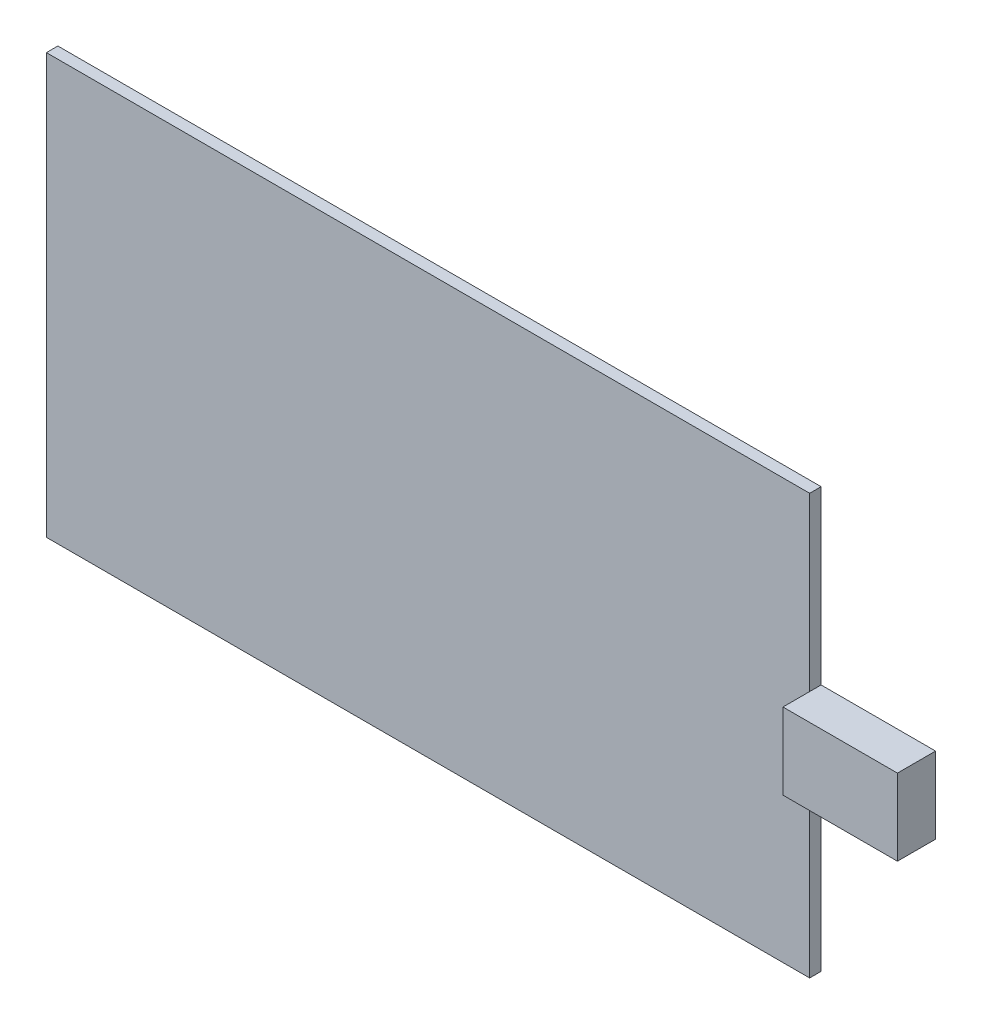
ISO-10303-21;
HEADER;
FILE_DESCRIPTION(('STEP AP214'),'2;1');
FILE_NAME('part.step','',(''),(''),'','','');
FILE_SCHEMA(('AUTOMOTIVE_DESIGN { 1 0 10303 214 1 1 1 1 }'));
ENDSEC;
DATA;
#1=APPLICATION_CONTEXT('core data for automotive mechanical design processes');
#2=APPLICATION_PROTOCOL_DEFINITION('international standard','automotive_design',2000,#1);
#3=PRODUCT_CONTEXT('',#1,'mechanical');
#4=PRODUCT('Part','Part','',(#3));
#5=PRODUCT_RELATED_PRODUCT_CATEGORY('part','',(#4));
#6=PRODUCT_DEFINITION_FORMATION('','',#4);
#7=PRODUCT_DEFINITION_CONTEXT('part definition',#1,'design');
#8=PRODUCT_DEFINITION('design','',#6,#7);
#9=PRODUCT_DEFINITION_SHAPE('','',#8);
#10=(LENGTH_UNIT() NAMED_UNIT(*) SI_UNIT(.MILLI.,.METRE.));
#11=(NAMED_UNIT(*) PLANE_ANGLE_UNIT() SI_UNIT($,.RADIAN.));
#12=(NAMED_UNIT(*) SI_UNIT($,.STERADIAN.) SOLID_ANGLE_UNIT());
#13=UNCERTAINTY_MEASURE_WITH_UNIT(LENGTH_MEASURE(1.E-05),#10,'distance_accuracy_value','');
#14=(GEOMETRIC_REPRESENTATION_CONTEXT(3) GLOBAL_UNCERTAINTY_ASSIGNED_CONTEXT((#13)) GLOBAL_UNIT_ASSIGNED_CONTEXT((#10,
#11,#12)) REPRESENTATION_CONTEXT('',''));
#15=CARTESIAN_POINT('',(0.,0.,0.));
#16=DIRECTION('',(0.,0.,1.));
#17=DIRECTION('',(1.,0.,0.));
#18=AXIS2_PLACEMENT_3D('',#15,#16,#17);
#19=CARTESIAN_POINT('',(0.,0.,1.5));
#20=DIRECTION('',(1.,0.,0.));
#21=DIRECTION('',(0.,0.,-1.));
#22=AXIS2_PLACEMENT_3D('',#19,#20,#21);
#23=PLANE('',#22);
#24=DIRECTION('',(0.,-1.,0.));
#25=VECTOR('',#24,1.);
#26=CARTESIAN_POINT('',(0.,0.,1.5));
#27=LINE('',#26,#25);
#28=CARTESIAN_POINT('',(0.,0.,1.5));
#29=VERTEX_POINT('',#28);
#30=CARTESIAN_POINT('',(0.,-22.5,1.5));
#31=VERTEX_POINT('',#30);
#32=EDGE_CURVE('E190',#29,#31,#27,.T.);
#33=ORIENTED_EDGE('',*,*,#32,.T.);
#34=DIRECTION('',(0.,0.,-1.));
#35=VECTOR('',#34,1.);
#36=CARTESIAN_POINT('',(0.,-22.5,5.));
#37=LINE('',#36,#35);
#38=CARTESIAN_POINT('',(0.,-22.5,0.));
#39=VERTEX_POINT('',#38);
#40=EDGE_CURVE('E55',#31,#39,#37,.T.);
#41=ORIENTED_EDGE('',*,*,#40,.T.);
#42=DIRECTION('',(0.,-1.,0.));
#43=VECTOR('',#42,1.);
#44=CARTESIAN_POINT('',(0.,0.,0.));
#45=LINE('',#44,#43);
#46=CARTESIAN_POINT('',(0.,0.,0.));
#47=VERTEX_POINT('',#46);
#48=EDGE_CURVE('E182',#47,#39,#45,.T.);
#49=ORIENTED_EDGE('',*,*,#48,.F.);
#50=DIRECTION('',(0.,0.,-1.));
#51=VECTOR('',#50,1.);
#52=CARTESIAN_POINT('',(0.,0.,1.5));
#53=LINE('',#52,#51);
#54=EDGE_CURVE('E73',#29,#47,#53,.T.);
#55=ORIENTED_EDGE('',*,*,#54,.F.);
#56=EDGE_LOOP('',(#33,#41,#49,#55));
#57=FACE_BOUND('',#56,.T.);
#58=ADVANCED_FACE('F45',(#57),#23,.T.);
#59=CARTESIAN_POINT('',(0.,0.,1.5));
#60=DIRECTION('',(0.,-1.,0.));
#61=DIRECTION('',(1.,0.,0.));
#62=AXIS2_PLACEMENT_3D('',#59,#60,#61);
#63=PLANE('',#62);
#64=DIRECTION('',(-1.,0.,0.));
#65=VECTOR('',#64,1.);
#66=CARTESIAN_POINT('',(0.,0.,0.));
#67=LINE('',#66,#65);
#68=CARTESIAN_POINT('',(-100.,0.,0.));
#69=VERTEX_POINT('',#68);
#70=EDGE_CURVE('E149',#47,#69,#67,.T.);
#71=ORIENTED_EDGE('',*,*,#70,.T.);
#72=DIRECTION('',(0.,0.,-1.));
#73=VECTOR('',#72,1.);
#74=CARTESIAN_POINT('',(-100.,0.,1.5));
#75=LINE('',#74,#73);
#76=CARTESIAN_POINT('',(-100.,0.,1.5));
#77=VERTEX_POINT('',#76);
#78=EDGE_CURVE('E49',#77,#69,#75,.T.);
#79=ORIENTED_EDGE('',*,*,#78,.F.);
#80=DIRECTION('',(-1.,0.,0.));
#81=VECTOR('',#80,1.);
#82=CARTESIAN_POINT('',(0.,0.,1.5));
#83=LINE('',#82,#81);
#84=EDGE_CURVE('E179',#29,#77,#83,.T.);
#85=ORIENTED_EDGE('',*,*,#84,.F.);
#86=ORIENTED_EDGE('',*,*,#54,.T.);
#87=EDGE_LOOP('',(#71,#79,#85,#86));
#88=FACE_BOUND('',#87,.T.);
#89=ADVANCED_FACE('F47',(#88),#63,.F.);
#90=CARTESIAN_POINT('',(-100.,0.,1.5));
#91=DIRECTION('',(1.,0.,0.));
#92=DIRECTION('',(0.,0.,-1.));
#93=AXIS2_PLACEMENT_3D('',#90,#91,#92);
#94=PLANE('',#93);
#95=DIRECTION('',(0.,-1.,0.));
#96=VECTOR('',#95,1.);
#97=CARTESIAN_POINT('',(-100.,0.,0.));
#98=LINE('',#97,#96);
#99=CARTESIAN_POINT('',(-100.,-55.,0.));
#100=VERTEX_POINT('',#99);
#101=EDGE_CURVE('E195',#69,#100,#98,.T.);
#102=ORIENTED_EDGE('',*,*,#101,.T.);
#103=DIRECTION('',(0.,0.,-1.));
#104=VECTOR('',#103,1.);
#105=CARTESIAN_POINT('',(-100.,-55.,1.5));
#106=LINE('',#105,#104);
#107=CARTESIAN_POINT('',(-100.,-55.,1.5));
#108=VERTEX_POINT('',#107);
#109=EDGE_CURVE('E212',#108,#100,#106,.T.);
#110=ORIENTED_EDGE('',*,*,#109,.F.);
#111=DIRECTION('',(0.,-1.,0.));
#112=VECTOR('',#111,1.);
#113=CARTESIAN_POINT('',(-100.,0.,1.5));
#114=LINE('',#113,#112);
#115=EDGE_CURVE('E100',#77,#108,#114,.T.);
#116=ORIENTED_EDGE('',*,*,#115,.F.);
#117=ORIENTED_EDGE('',*,*,#78,.T.);
#118=EDGE_LOOP('',(#102,#110,#116,#117));
#119=FACE_BOUND('',#118,.T.);
#120=ADVANCED_FACE('F233',(#119),#94,.F.);
#121=CARTESIAN_POINT('',(0.,-55.,1.5));
#122=DIRECTION('',(0.,-1.,0.));
#123=DIRECTION('',(1.,0.,0.));
#124=AXIS2_PLACEMENT_3D('',#121,#122,#123);
#125=PLANE('',#124);
#126=DIRECTION('',(-1.,0.,0.));
#127=VECTOR('',#126,1.);
#128=CARTESIAN_POINT('',(0.,-55.,0.));
#129=LINE('',#128,#127);
#130=CARTESIAN_POINT('',(0.,-55.,0.));
#131=VERTEX_POINT('',#130);
#132=EDGE_CURVE('E199',#131,#100,#129,.T.);
#133=ORIENTED_EDGE('',*,*,#132,.F.);
#134=DIRECTION('',(0.,0.,-1.));
#135=VECTOR('',#134,1.);
#136=CARTESIAN_POINT('',(0.,-55.,1.5));
#137=LINE('',#136,#135);
#138=CARTESIAN_POINT('',(0.,-55.,1.5));
#139=VERTEX_POINT('',#138);
#140=EDGE_CURVE('E209',#139,#131,#137,.T.);
#141=ORIENTED_EDGE('',*,*,#140,.F.);
#142=DIRECTION('',(-1.,0.,0.));
#143=VECTOR('',#142,1.);
#144=CARTESIAN_POINT('',(0.,-55.,1.5));
#145=LINE('',#144,#143);
#146=EDGE_CURVE('E185',#139,#108,#145,.T.);
#147=ORIENTED_EDGE('',*,*,#146,.T.);
#148=ORIENTED_EDGE('',*,*,#109,.T.);
#149=EDGE_LOOP('',(#133,#141,#147,#148));
#150=FACE_BOUND('',#149,.T.);
#151=ADVANCED_FACE('F232',(#150),#125,.T.);
#152=DIRECTION('',(0.,0.,-1.));
#153=VECTOR('',#152,1.);
#154=CARTESIAN_POINT('',(0.,-32.5,5.));
#155=LINE('',#154,#153);
#156=CARTESIAN_POINT('',(0.,-32.5,1.5));
#157=VERTEX_POINT('',#156);
#158=CARTESIAN_POINT('',(0.,-32.5,0.));
#159=VERTEX_POINT('',#158);
#160=EDGE_CURVE('E11',#157,#159,#155,.T.);
#161=ORIENTED_EDGE('',*,*,#160,.F.);
#162=EDGE_CURVE('E189',#157,#139,#27,.T.);
#163=ORIENTED_EDGE('',*,*,#162,.T.);
#164=ORIENTED_EDGE('',*,*,#140,.T.);
#165=EDGE_CURVE('E203',#159,#131,#45,.T.);
#166=ORIENTED_EDGE('',*,*,#165,.F.);
#167=EDGE_LOOP('',(#161,#163,#164,#166));
#168=FACE_BOUND('',#167,.T.);
#169=ADVANCED_FACE('F230',(#168),#23,.T.);
#170=CARTESIAN_POINT('',(0.,0.,1.5));
#171=DIRECTION('',(0.,0.,1.));
#172=DIRECTION('',(1.,0.,0.));
#173=AXIS2_PLACEMENT_3D('',#170,#171,#172);
#174=PLANE('',#173);
#175=ORIENTED_EDGE('',*,*,#84,.T.);
#176=ORIENTED_EDGE('',*,*,#115,.T.);
#177=ORIENTED_EDGE('',*,*,#146,.F.);
#178=ORIENTED_EDGE('',*,*,#162,.F.);
#179=EDGE_CURVE('E145',#31,#157,#27,.T.);
#180=ORIENTED_EDGE('',*,*,#179,.F.);
#181=ORIENTED_EDGE('',*,*,#32,.F.);
#182=EDGE_LOOP('',(#175,#176,#177,#178,#180,#181));
#183=FACE_BOUND('',#182,.T.);
#184=ADVANCED_FACE('F223',(#183),#174,.T.);
#185=CARTESIAN_POINT('',(0.,0.,0.));
#186=DIRECTION('',(0.,0.,1.));
#187=DIRECTION('',(1.,0.,0.));
#188=AXIS2_PLACEMENT_3D('',#185,#186,#187);
#189=PLANE('',#188);
#190=ORIENTED_EDGE('',*,*,#70,.F.);
#191=ORIENTED_EDGE('',*,*,#48,.T.);
#192=DIRECTION('',(1.,0.,0.));
#193=VECTOR('',#192,1.);
#194=CARTESIAN_POINT('',(0.,-22.5,0.));
#195=LINE('',#194,#193);
#196=CARTESIAN_POINT('',(15.,-22.5,0.));
#197=VERTEX_POINT('',#196);
#198=EDGE_CURVE('E64',#39,#197,#195,.T.);
#199=ORIENTED_EDGE('',*,*,#198,.T.);
#200=DIRECTION('',(0.,-1.,0.));
#201=VECTOR('',#200,1.);
#202=CARTESIAN_POINT('',(15.,0.,0.));
#203=LINE('',#202,#201);
#204=CARTESIAN_POINT('',(15.,-32.5,0.));
#205=VERTEX_POINT('',#204);
#206=EDGE_CURVE('E166',#197,#205,#203,.T.);
#207=ORIENTED_EDGE('',*,*,#206,.T.);
#208=DIRECTION('',(-1.,0.,0.));
#209=VECTOR('',#208,1.);
#210=CARTESIAN_POINT('',(0.,-32.5,0.));
#211=LINE('',#210,#209);
#212=EDGE_CURVE('E162',#205,#159,#211,.T.);
#213=ORIENTED_EDGE('',*,*,#212,.T.);
#214=ORIENTED_EDGE('',*,*,#165,.T.);
#215=ORIENTED_EDGE('',*,*,#132,.T.);
#216=ORIENTED_EDGE('',*,*,#101,.F.);
#217=EDGE_LOOP('',(#190,#191,#199,#207,#213,#214,#215,#216));
#218=FACE_BOUND('',#217,.T.);
#219=ADVANCED_FACE('F221',(#218),#189,.F.);
#220=CARTESIAN_POINT('',(0.,0.,5.));
#221=DIRECTION('',(1.,0.,0.));
#222=DIRECTION('',(0.,0.,-1.));
#223=AXIS2_PLACEMENT_3D('',#220,#221,#222);
#224=PLANE('',#223);
#225=CARTESIAN_POINT('',(0.,-22.5,5.));
#226=VERTEX_POINT('',#225);
#227=EDGE_CURVE('E161',#226,#31,#37,.T.);
#228=ORIENTED_EDGE('',*,*,#227,.T.);
#229=ORIENTED_EDGE('',*,*,#179,.T.);
#230=CARTESIAN_POINT('',(0.,-32.5,5.));
#231=VERTEX_POINT('',#230);
#232=EDGE_CURVE('E57',#231,#157,#155,.T.);
#233=ORIENTED_EDGE('',*,*,#232,.F.);
#234=DIRECTION('',(0.,-1.,0.));
#235=VECTOR('',#234,1.);
#236=CARTESIAN_POINT('',(0.,0.,5.));
#237=LINE('',#236,#235);
#238=EDGE_CURVE('E129',#226,#231,#237,.T.);
#239=ORIENTED_EDGE('',*,*,#238,.F.);
#240=EDGE_LOOP('',(#228,#229,#233,#239));
#241=FACE_BOUND('',#240,.T.);
#242=ADVANCED_FACE('F143',(#241),#224,.F.);
#243=CARTESIAN_POINT('',(0.,-32.5,5.));
#244=DIRECTION('',(0.,-1.,0.));
#245=DIRECTION('',(0.,0.,-1.));
#246=AXIS2_PLACEMENT_3D('',#243,#244,#245);
#247=PLANE('',#246);
#248=ORIENTED_EDGE('',*,*,#212,.F.);
#249=DIRECTION('',(0.,0.,-1.));
#250=VECTOR('',#249,1.);
#251=CARTESIAN_POINT('',(15.,-32.5,5.));
#252=LINE('',#251,#250);
#253=CARTESIAN_POINT('',(15.,-32.5,5.));
#254=VERTEX_POINT('',#253);
#255=EDGE_CURVE('E150',#254,#205,#252,.T.);
#256=ORIENTED_EDGE('',*,*,#255,.F.);
#257=DIRECTION('',(-1.,0.,0.));
#258=VECTOR('',#257,1.);
#259=CARTESIAN_POINT('',(0.,-32.5,5.));
#260=LINE('',#259,#258);
#261=EDGE_CURVE('E134',#254,#231,#260,.T.);
#262=ORIENTED_EDGE('',*,*,#261,.T.);
#263=ORIENTED_EDGE('',*,*,#232,.T.);
#264=ORIENTED_EDGE('',*,*,#160,.T.);
#265=EDGE_LOOP('',(#248,#256,#262,#263,#264));
#266=FACE_BOUND('',#265,.T.);
#267=ADVANCED_FACE('F152',(#266),#247,.T.);
#268=CARTESIAN_POINT('',(15.,0.,5.));
#269=DIRECTION('',(1.,0.,0.));
#270=DIRECTION('',(0.,0.,-1.));
#271=AXIS2_PLACEMENT_3D('',#268,#269,#270);
#272=PLANE('',#271);
#273=ORIENTED_EDGE('',*,*,#206,.F.);
#274=DIRECTION('',(0.,0.,-1.));
#275=VECTOR('',#274,1.);
#276=CARTESIAN_POINT('',(15.,-22.5,5.));
#277=LINE('',#276,#275);
#278=CARTESIAN_POINT('',(15.,-22.5,5.));
#279=VERTEX_POINT('',#278);
#280=EDGE_CURVE('E174',#279,#197,#277,.T.);
#281=ORIENTED_EDGE('',*,*,#280,.F.);
#282=DIRECTION('',(0.,-1.,0.));
#283=VECTOR('',#282,1.);
#284=CARTESIAN_POINT('',(15.,0.,5.));
#285=LINE('',#284,#283);
#286=EDGE_CURVE('E154',#279,#254,#285,.T.);
#287=ORIENTED_EDGE('',*,*,#286,.T.);
#288=ORIENTED_EDGE('',*,*,#255,.T.);
#289=EDGE_LOOP('',(#273,#281,#287,#288));
#290=FACE_BOUND('',#289,.T.);
#291=ADVANCED_FACE('F237',(#290),#272,.T.);
#292=CARTESIAN_POINT('',(0.,-22.5,5.));
#293=DIRECTION('',(0.,1.,0.));
#294=DIRECTION('',(0.,0.,1.));
#295=AXIS2_PLACEMENT_3D('',#292,#293,#294);
#296=PLANE('',#295);
#297=ORIENTED_EDGE('',*,*,#198,.F.);
#298=ORIENTED_EDGE('',*,*,#40,.F.);
#299=ORIENTED_EDGE('',*,*,#227,.F.);
#300=DIRECTION('',(1.,0.,0.));
#301=VECTOR('',#300,1.);
#302=CARTESIAN_POINT('',(0.,-22.5,5.));
#303=LINE('',#302,#301);
#304=EDGE_CURVE('E137',#226,#279,#303,.T.);
#305=ORIENTED_EDGE('',*,*,#304,.T.);
#306=ORIENTED_EDGE('',*,*,#280,.T.);
#307=EDGE_LOOP('',(#297,#298,#299,#305,#306));
#308=FACE_BOUND('',#307,.T.);
#309=ADVANCED_FACE('F238',(#308),#296,.T.);
#310=CARTESIAN_POINT('',(0.,0.,5.));
#311=DIRECTION('',(0.,0.,1.));
#312=DIRECTION('',(1.,0.,0.));
#313=AXIS2_PLACEMENT_3D('',#310,#311,#312);
#314=PLANE('',#313);
#315=ORIENTED_EDGE('',*,*,#238,.T.);
#316=ORIENTED_EDGE('',*,*,#261,.F.);
#317=ORIENTED_EDGE('',*,*,#286,.F.);
#318=ORIENTED_EDGE('',*,*,#304,.F.);
#319=EDGE_LOOP('',(#315,#316,#317,#318));
#320=FACE_BOUND('',#319,.T.);
#321=ADVANCED_FACE('F131',(#320),#314,.T.);
#322=CLOSED_SHELL('',(#58,#89,#120,#151,#169,#184,#219,#242,#267,#291,#309,#321));
#323=MANIFOLD_SOLID_BREP('B2',#322);
#324=ADVANCED_BREP_SHAPE_REPRESENTATION('',(#18,#323),#14);
#325=SHAPE_DEFINITION_REPRESENTATION(#9,#324);
ENDSEC;
END-ISO-10303-21;
